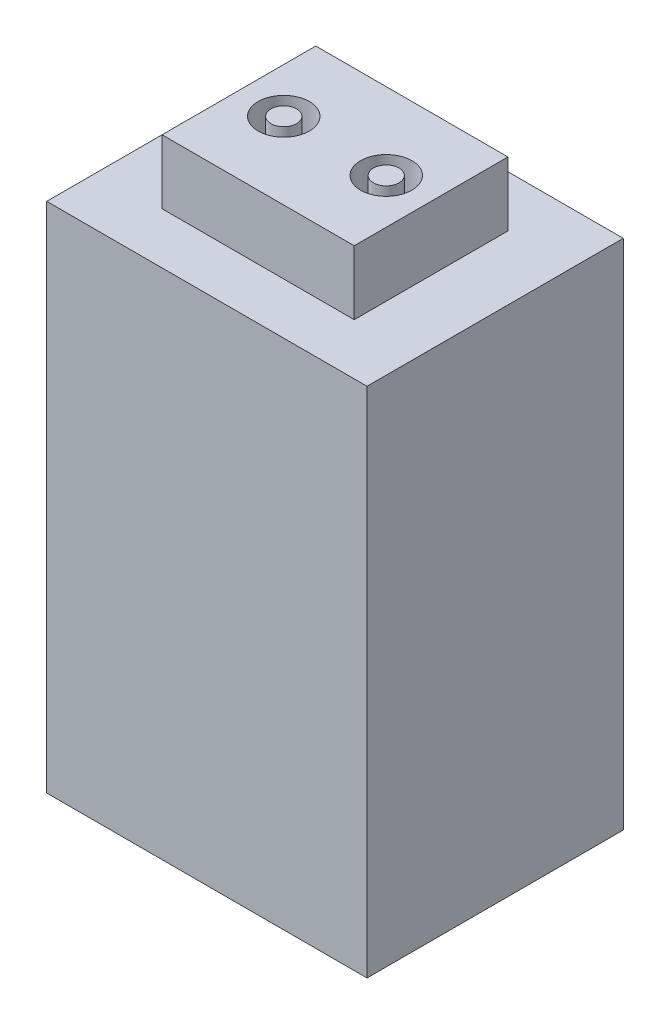
ISO-10303-21;
HEADER;
FILE_DESCRIPTION(('STEP AP214'),'2;1');
FILE_NAME('part.step','',(''),(''),'','','');
FILE_SCHEMA(('AUTOMOTIVE_DESIGN { 1 0 10303 214 1 1 1 1 }'));
ENDSEC;
DATA;
#1=APPLICATION_CONTEXT('core data for automotive mechanical design processes');
#2=APPLICATION_PROTOCOL_DEFINITION('international standard','automotive_design',2000,#1);
#3=PRODUCT_CONTEXT('',#1,'mechanical');
#4=PRODUCT('Part','Part','',(#3));
#5=PRODUCT_RELATED_PRODUCT_CATEGORY('part','',(#4));
#6=PRODUCT_DEFINITION_FORMATION('','',#4);
#7=PRODUCT_DEFINITION_CONTEXT('part definition',#1,'design');
#8=PRODUCT_DEFINITION('design','',#6,#7);
#9=PRODUCT_DEFINITION_SHAPE('','',#8);
#10=(LENGTH_UNIT() NAMED_UNIT(*) SI_UNIT(.MILLI.,.METRE.));
#11=(NAMED_UNIT(*) PLANE_ANGLE_UNIT() SI_UNIT($,.RADIAN.));
#12=(NAMED_UNIT(*) SI_UNIT($,.STERADIAN.) SOLID_ANGLE_UNIT());
#13=UNCERTAINTY_MEASURE_WITH_UNIT(LENGTH_MEASURE(1.E-05),#10,'distance_accuracy_value','');
#14=(GEOMETRIC_REPRESENTATION_CONTEXT(3) GLOBAL_UNCERTAINTY_ASSIGNED_CONTEXT((#13)) GLOBAL_UNIT_ASSIGNED_CONTEXT((#10,
#11,#12)) REPRESENTATION_CONTEXT('',''));
#15=CARTESIAN_POINT('',(0.,0.,0.));
#16=DIRECTION('',(0.,0.,1.));
#17=DIRECTION('',(1.,0.,0.));
#18=AXIS2_PLACEMENT_3D('',#15,#16,#17);
#19=CARTESIAN_POINT('',(0.,80.,40.));
#20=DIRECTION('',(0.,-1.,0.));
#21=DIRECTION('',(0.,0.,-1.));
#22=AXIS2_PLACEMENT_3D('',#19,#20,#21);
#23=PLANE('',#22);
#24=DIRECTION('',(-1.,0.,0.));
#25=VECTOR('',#24,1.);
#26=CARTESIAN_POINT('',(0.,80.,0.));
#27=LINE('',#26,#25);
#28=CARTESIAN_POINT('',(0.,80.,0.));
#29=VERTEX_POINT('',#28);
#30=CARTESIAN_POINT('',(-50.,80.,0.));
#31=VERTEX_POINT('',#30);
#32=EDGE_CURVE('E151',#29,#31,#27,.T.);
#33=ORIENTED_EDGE('',*,*,#32,.T.);
#34=DIRECTION('',(0.,0.,-1.));
#35=VECTOR('',#34,1.);
#36=CARTESIAN_POINT('',(-50.,80.,40.));
#37=LINE('',#36,#35);
#38=CARTESIAN_POINT('',(-50.,80.,40.));
#39=VERTEX_POINT('',#38);
#40=EDGE_CURVE('E156',#39,#31,#37,.T.);
#41=ORIENTED_EDGE('',*,*,#40,.F.);
#42=DIRECTION('',(-1.,0.,0.));
#43=VECTOR('',#42,1.);
#44=CARTESIAN_POINT('',(0.,80.,40.));
#45=LINE('',#44,#43);
#46=CARTESIAN_POINT('',(0.,80.,40.));
#47=VERTEX_POINT('',#46);
#48=EDGE_CURVE('E144',#47,#39,#45,.T.);
#49=ORIENTED_EDGE('',*,*,#48,.F.);
#50=DIRECTION('',(0.,0.,-1.));
#51=VECTOR('',#50,1.);
#52=CARTESIAN_POINT('',(0.,80.,40.));
#53=LINE('',#52,#51);
#54=EDGE_CURVE('E52',#47,#29,#53,.T.);
#55=ORIENTED_EDGE('',*,*,#54,.T.);
#56=EDGE_LOOP('',(#33,#41,#49,#55));
#57=FACE_BOUND('',#56,.T.);
#58=DIRECTION('',(0.,0.,-1.));
#59=VECTOR('',#58,1.);
#60=CARTESIAN_POINT('',(-10.,80.,8.));
#61=LINE('',#60,#59);
#62=CARTESIAN_POINT('',(-10.,80.,32.));
#63=VERTEX_POINT('',#62);
#64=CARTESIAN_POINT('',(-10.,80.,8.));
#65=VERTEX_POINT('',#64);
#66=EDGE_CURVE('E58',#63,#65,#61,.T.);
#67=ORIENTED_EDGE('',*,*,#66,.F.);
#68=DIRECTION('',(1.,0.,0.));
#69=VECTOR('',#68,1.);
#70=CARTESIAN_POINT('',(-40.,80.,32.));
#71=LINE('',#70,#69);
#72=CARTESIAN_POINT('',(-40.,80.,32.));
#73=VERTEX_POINT('',#72);
#74=EDGE_CURVE('E61',#73,#63,#71,.T.);
#75=ORIENTED_EDGE('',*,*,#74,.F.);
#76=DIRECTION('',(0.,0.,1.));
#77=VECTOR('',#76,1.);
#78=CARTESIAN_POINT('',(-40.,80.,8.));
#79=LINE('',#78,#77);
#80=CARTESIAN_POINT('',(-40.,80.,8.));
#81=VERTEX_POINT('',#80);
#82=EDGE_CURVE('E273',#81,#73,#79,.T.);
#83=ORIENTED_EDGE('',*,*,#82,.F.);
#84=DIRECTION('',(-1.,0.,0.));
#85=VECTOR('',#84,1.);
#86=CARTESIAN_POINT('',(-40.,80.,8.));
#87=LINE('',#86,#85);
#88=EDGE_CURVE('E275',#65,#81,#87,.T.);
#89=ORIENTED_EDGE('',*,*,#88,.F.);
#90=EDGE_LOOP('',(#67,#75,#83,#89));
#91=FACE_BOUND('',#90,.T.);
#92=ADVANCED_FACE('F44',(#57,#91),#23,.F.);
#93=CARTESIAN_POINT('',(0.,0.,40.));
#94=DIRECTION('',(0.,1.,0.));
#95=DIRECTION('',(0.,0.,1.));
#96=AXIS2_PLACEMENT_3D('',#93,#94,#95);
#97=PLANE('',#96);
#98=DIRECTION('',(1.,0.,0.));
#99=VECTOR('',#98,1.);
#100=CARTESIAN_POINT('',(0.,0.,0.));
#101=LINE('',#100,#99);
#102=CARTESIAN_POINT('',(-50.,0.,0.));
#103=VERTEX_POINT('',#102);
#104=CARTESIAN_POINT('',(0.,0.,0.));
#105=VERTEX_POINT('',#104);
#106=EDGE_CURVE('E128',#103,#105,#101,.T.);
#107=ORIENTED_EDGE('',*,*,#106,.T.);
#108=DIRECTION('',(0.,0.,-1.));
#109=VECTOR('',#108,1.);
#110=CARTESIAN_POINT('',(0.,0.,40.));
#111=LINE('',#110,#109);
#112=CARTESIAN_POINT('',(0.,0.,40.));
#113=VERTEX_POINT('',#112);
#114=EDGE_CURVE('E11',#113,#105,#111,.T.);
#115=ORIENTED_EDGE('',*,*,#114,.F.);
#116=DIRECTION('',(1.,0.,0.));
#117=VECTOR('',#116,1.);
#118=CARTESIAN_POINT('',(0.,0.,40.));
#119=LINE('',#118,#117);
#120=CARTESIAN_POINT('',(-50.,0.,40.));
#121=VERTEX_POINT('',#120);
#122=EDGE_CURVE('E138',#121,#113,#119,.T.);
#123=ORIENTED_EDGE('',*,*,#122,.F.);
#124=DIRECTION('',(0.,0.,-1.));
#125=VECTOR('',#124,1.);
#126=CARTESIAN_POINT('',(-50.,0.,40.));
#127=LINE('',#126,#125);
#128=EDGE_CURVE('E146',#121,#103,#127,.T.);
#129=ORIENTED_EDGE('',*,*,#128,.T.);
#130=EDGE_LOOP('',(#107,#115,#123,#129));
#131=FACE_BOUND('',#130,.T.);
#132=ADVANCED_FACE('F50',(#131),#97,.F.);
#133=CARTESIAN_POINT('',(0.,0.,40.));
#134=DIRECTION('',(-1.,0.,0.));
#135=DIRECTION('',(0.,0.,1.));
#136=AXIS2_PLACEMENT_3D('',#133,#134,#135);
#137=PLANE('',#136);
#138=DIRECTION('',(0.,1.,0.));
#139=VECTOR('',#138,1.);
#140=CARTESIAN_POINT('',(0.,0.,0.));
#141=LINE('',#140,#139);
#142=EDGE_CURVE('E134',#105,#29,#141,.T.);
#143=ORIENTED_EDGE('',*,*,#142,.T.);
#144=ORIENTED_EDGE('',*,*,#54,.F.);
#145=DIRECTION('',(0.,1.,0.));
#146=VECTOR('',#145,1.);
#147=CARTESIAN_POINT('',(0.,0.,40.));
#148=LINE('',#147,#146);
#149=EDGE_CURVE('E142',#113,#47,#148,.T.);
#150=ORIENTED_EDGE('',*,*,#149,.F.);
#151=ORIENTED_EDGE('',*,*,#114,.T.);
#152=EDGE_LOOP('',(#143,#144,#150,#151));
#153=FACE_BOUND('',#152,.T.);
#154=ADVANCED_FACE('F180',(#153),#137,.F.);
#155=CARTESIAN_POINT('',(-50.,0.,40.));
#156=DIRECTION('',(1.,0.,0.));
#157=DIRECTION('',(0.,0.,-1.));
#158=AXIS2_PLACEMENT_3D('',#155,#156,#157);
#159=PLANE('',#158);
#160=DIRECTION('',(0.,-1.,0.));
#161=VECTOR('',#160,1.);
#162=CARTESIAN_POINT('',(-50.,0.,0.));
#163=LINE('',#162,#161);
#164=EDGE_CURVE('E141',#31,#103,#163,.T.);
#165=ORIENTED_EDGE('',*,*,#164,.T.);
#166=ORIENTED_EDGE('',*,*,#128,.F.);
#167=DIRECTION('',(0.,-1.,0.));
#168=VECTOR('',#167,1.);
#169=CARTESIAN_POINT('',(-50.,0.,40.));
#170=LINE('',#169,#168);
#171=EDGE_CURVE('E150',#39,#121,#170,.T.);
#172=ORIENTED_EDGE('',*,*,#171,.F.);
#173=ORIENTED_EDGE('',*,*,#40,.T.);
#174=EDGE_LOOP('',(#165,#166,#172,#173));
#175=FACE_BOUND('',#174,.T.);
#176=ADVANCED_FACE('F172',(#175),#159,.F.);
#177=CARTESIAN_POINT('',(0.,0.,40.));
#178=DIRECTION('',(0.,0.,-1.));
#179=DIRECTION('',(-1.,0.,0.));
#180=AXIS2_PLACEMENT_3D('',#177,#178,#179);
#181=PLANE('',#180);
#182=ORIENTED_EDGE('',*,*,#122,.T.);
#183=ORIENTED_EDGE('',*,*,#149,.T.);
#184=ORIENTED_EDGE('',*,*,#48,.T.);
#185=ORIENTED_EDGE('',*,*,#171,.T.);
#186=EDGE_LOOP('',(#182,#183,#184,#185));
#187=FACE_BOUND('',#186,.T.);
#188=ADVANCED_FACE('F176',(#187),#181,.F.);
#189=CARTESIAN_POINT('',(0.,0.,0.));
#190=DIRECTION('',(0.,0.,-1.));
#191=DIRECTION('',(-1.,0.,0.));
#192=AXIS2_PLACEMENT_3D('',#189,#190,#191);
#193=PLANE('',#192);
#194=ORIENTED_EDGE('',*,*,#106,.F.);
#195=ORIENTED_EDGE('',*,*,#164,.F.);
#196=ORIENTED_EDGE('',*,*,#32,.F.);
#197=ORIENTED_EDGE('',*,*,#142,.F.);
#198=EDGE_LOOP('',(#194,#195,#196,#197));
#199=FACE_BOUND('',#198,.T.);
#200=ADVANCED_FACE('F169',(#199),#193,.T.);
#201=CARTESIAN_POINT('',(-10.,90.,8.));
#202=DIRECTION('',(-1.,0.,0.));
#203=DIRECTION('',(0.,0.,1.));
#204=AXIS2_PLACEMENT_3D('',#201,#202,#203);
#205=PLANE('',#204);
#206=ORIENTED_EDGE('',*,*,#66,.T.);
#207=DIRECTION('',(0.,-1.,0.));
#208=VECTOR('',#207,1.);
#209=CARTESIAN_POINT('',(-10.,90.,8.));
#210=LINE('',#209,#208);
#211=CARTESIAN_POINT('',(-10.,90.,8.));
#212=VERTEX_POINT('',#211);
#213=EDGE_CURVE('E114',#212,#65,#210,.T.);
#214=ORIENTED_EDGE('',*,*,#213,.F.);
#215=DIRECTION('',(0.,0.,-1.));
#216=VECTOR('',#215,1.);
#217=CARTESIAN_POINT('',(-10.,90.,8.));
#218=LINE('',#217,#216);
#219=CARTESIAN_POINT('',(-10.,90.,32.));
#220=VERTEX_POINT('',#219);
#221=EDGE_CURVE('E116',#220,#212,#218,.T.);
#222=ORIENTED_EDGE('',*,*,#221,.F.);
#223=DIRECTION('',(0.,-1.,0.));
#224=VECTOR('',#223,1.);
#225=CARTESIAN_POINT('',(-10.,90.,32.));
#226=LINE('',#225,#224);
#227=EDGE_CURVE('E269',#220,#63,#226,.T.);
#228=ORIENTED_EDGE('',*,*,#227,.T.);
#229=EDGE_LOOP('',(#206,#214,#222,#228));
#230=FACE_BOUND('',#229,.T.);
#231=ADVANCED_FACE('F129',(#230),#205,.F.);
#232=CARTESIAN_POINT('',(-40.,90.,8.));
#233=DIRECTION('',(0.,0.,1.));
#234=DIRECTION('',(1.,0.,0.));
#235=AXIS2_PLACEMENT_3D('',#232,#233,#234);
#236=PLANE('',#235);
#237=ORIENTED_EDGE('',*,*,#88,.T.);
#238=DIRECTION('',(0.,-1.,0.));
#239=VECTOR('',#238,1.);
#240=CARTESIAN_POINT('',(-40.,90.,8.));
#241=LINE('',#240,#239);
#242=CARTESIAN_POINT('',(-40.,90.,8.));
#243=VERTEX_POINT('',#242);
#244=EDGE_CURVE('E113',#243,#81,#241,.T.);
#245=ORIENTED_EDGE('',*,*,#244,.F.);
#246=DIRECTION('',(-1.,0.,0.));
#247=VECTOR('',#246,1.);
#248=CARTESIAN_POINT('',(-40.,90.,8.));
#249=LINE('',#248,#247);
#250=EDGE_CURVE('E107',#212,#243,#249,.T.);
#251=ORIENTED_EDGE('',*,*,#250,.F.);
#252=ORIENTED_EDGE('',*,*,#213,.T.);
#253=EDGE_LOOP('',(#237,#245,#251,#252));
#254=FACE_BOUND('',#253,.T.);
#255=ADVANCED_FACE('F112',(#254),#236,.F.);
#256=CARTESIAN_POINT('',(-40.,90.,8.));
#257=DIRECTION('',(1.,0.,0.));
#258=DIRECTION('',(0.,0.,-1.));
#259=AXIS2_PLACEMENT_3D('',#256,#257,#258);
#260=PLANE('',#259);
#261=ORIENTED_EDGE('',*,*,#82,.T.);
#262=DIRECTION('',(0.,-1.,0.));
#263=VECTOR('',#262,1.);
#264=CARTESIAN_POINT('',(-40.,90.,32.));
#265=LINE('',#264,#263);
#266=CARTESIAN_POINT('',(-40.,90.,32.));
#267=VERTEX_POINT('',#266);
#268=EDGE_CURVE('E133',#267,#73,#265,.T.);
#269=ORIENTED_EDGE('',*,*,#268,.F.);
#270=DIRECTION('',(0.,0.,1.));
#271=VECTOR('',#270,1.);
#272=CARTESIAN_POINT('',(-40.,90.,8.));
#273=LINE('',#272,#271);
#274=EDGE_CURVE('E119',#243,#267,#273,.T.);
#275=ORIENTED_EDGE('',*,*,#274,.F.);
#276=ORIENTED_EDGE('',*,*,#244,.T.);
#277=EDGE_LOOP('',(#261,#269,#275,#276));
#278=FACE_BOUND('',#277,.T.);
#279=ADVANCED_FACE('F200',(#278),#260,.F.);
#280=CARTESIAN_POINT('',(-40.,90.,32.));
#281=DIRECTION('',(0.,0.,-1.));
#282=DIRECTION('',(-1.,0.,0.));
#283=AXIS2_PLACEMENT_3D('',#280,#281,#282);
#284=PLANE('',#283);
#285=ORIENTED_EDGE('',*,*,#74,.T.);
#286=ORIENTED_EDGE('',*,*,#227,.F.);
#287=DIRECTION('',(1.,0.,0.));
#288=VECTOR('',#287,1.);
#289=CARTESIAN_POINT('',(-40.,90.,32.));
#290=LINE('',#289,#288);
#291=EDGE_CURVE('E123',#267,#220,#290,.T.);
#292=ORIENTED_EDGE('',*,*,#291,.F.);
#293=ORIENTED_EDGE('',*,*,#268,.T.);
#294=EDGE_LOOP('',(#285,#286,#292,#293));
#295=FACE_BOUND('',#294,.T.);
#296=ADVANCED_FACE('F205',(#295),#284,.F.);
#297=CARTESIAN_POINT('',(0.,90.,0.));
#298=DIRECTION('',(0.,1.,0.));
#299=DIRECTION('',(0.,0.,1.));
#300=AXIS2_PLACEMENT_3D('',#297,#298,#299);
#301=PLANE('',#300);
#302=CARTESIAN_POINT('',(-17.,90.,20.));
#303=DIRECTION('',(0.,1.,0.));
#304=DIRECTION('',(0.,0.,1.));
#305=AXIS2_PLACEMENT_3D('',#302,#303,#304);
#306=CIRCLE('',#305,4.);
#307=CARTESIAN_POINT('',(-17.,90.,24.));
#308=VERTEX_POINT('',#307);
#309=EDGE_CURVE('E248',#308,#308,#306,.T.);
#310=ORIENTED_EDGE('',*,*,#309,.F.);
#311=EDGE_LOOP('',(#310));
#312=FACE_BOUND('',#311,.T.);
#313=CARTESIAN_POINT('',(-33.,90.,20.));
#314=DIRECTION('',(0.,1.,0.));
#315=DIRECTION('',(0.,0.,1.));
#316=AXIS2_PLACEMENT_3D('',#313,#314,#315);
#317=CIRCLE('',#316,4.);
#318=CARTESIAN_POINT('',(-33.,90.,24.));
#319=VERTEX_POINT('',#318);
#320=EDGE_CURVE('E257',#319,#319,#317,.T.);
#321=ORIENTED_EDGE('',*,*,#320,.F.);
#322=EDGE_LOOP('',(#321));
#323=FACE_BOUND('',#322,.T.);
#324=ORIENTED_EDGE('',*,*,#221,.T.);
#325=ORIENTED_EDGE('',*,*,#250,.T.);
#326=ORIENTED_EDGE('',*,*,#274,.T.);
#327=ORIENTED_EDGE('',*,*,#291,.T.);
#328=EDGE_LOOP('',(#324,#325,#326,#327));
#329=FACE_BOUND('',#328,.T.);
#330=ADVANCED_FACE('F121',(#312,#323,#329),#301,.T.);
#331=CARTESIAN_POINT('',(-33.,85.,20.));
#332=DIRECTION('',(0.,1.,0.));
#333=DIRECTION('',(0.,0.,1.));
#334=AXIS2_PLACEMENT_3D('',#331,#332,#333);
#335=CYLINDRICAL_SURFACE('',#334,4.);
#336=CARTESIAN_POINT('',(-33.,85.,20.));
#337=DIRECTION('',(0.,1.,0.));
#338=DIRECTION('',(0.,0.,1.));
#339=AXIS2_PLACEMENT_3D('',#336,#337,#338);
#340=CIRCLE('',#339,4.);
#341=CARTESIAN_POINT('',(-33.,85.,24.));
#342=VERTEX_POINT('',#341);
#343=EDGE_CURVE('E263',#342,#342,#340,.T.);
#344=ORIENTED_EDGE('',*,*,#343,.F.);
#345=EDGE_LOOP('',(#344));
#346=FACE_BOUND('',#345,.T.);
#347=ORIENTED_EDGE('',*,*,#320,.T.);
#348=EDGE_LOOP('',(#347));
#349=FACE_BOUND('',#348,.T.);
#350=ADVANCED_FACE('F207',(#346,#349),#335,.F.);
#351=CARTESIAN_POINT('',(-33.,85.,20.));
#352=DIRECTION('',(0.,1.,0.));
#353=DIRECTION('',(0.,0.,1.));
#354=AXIS2_PLACEMENT_3D('',#351,#352,#353);
#355=PLANE('',#354);
#356=CARTESIAN_POINT('',(-33.,85.,20.));
#357=DIRECTION('',(0.,1.,0.));
#358=DIRECTION('',(0.,0.,1.));
#359=AXIS2_PLACEMENT_3D('',#356,#357,#358);
#360=CIRCLE('',#359,2.);
#361=CARTESIAN_POINT('',(-33.,85.,22.));
#362=VERTEX_POINT('',#361);
#363=EDGE_CURVE('E252',#362,#362,#360,.T.);
#364=ORIENTED_EDGE('',*,*,#363,.F.);
#365=EDGE_LOOP('',(#364));
#366=FACE_BOUND('',#365,.T.);
#367=ORIENTED_EDGE('',*,*,#343,.T.);
#368=EDGE_LOOP('',(#367));
#369=FACE_BOUND('',#368,.T.);
#370=ADVANCED_FACE('F220',(#366,#369),#355,.T.);
#371=CARTESIAN_POINT('',(-33.,85.,20.));
#372=DIRECTION('',(0.,1.,0.));
#373=DIRECTION('',(0.,0.,1.));
#374=AXIS2_PLACEMENT_3D('',#371,#372,#373);
#375=CYLINDRICAL_SURFACE('',#374,2.);
#376=ORIENTED_EDGE('',*,*,#363,.T.);
#377=EDGE_LOOP('',(#376));
#378=FACE_BOUND('',#377,.T.);
#379=CARTESIAN_POINT('',(-33.,90.,20.));
#380=DIRECTION('',(0.,1.,0.));
#381=DIRECTION('',(0.,0.,1.));
#382=AXIS2_PLACEMENT_3D('',#379,#380,#381);
#383=CIRCLE('',#382,2.);
#384=CARTESIAN_POINT('',(-33.,90.,22.));
#385=VERTEX_POINT('',#384);
#386=EDGE_CURVE('E246',#385,#385,#383,.T.);
#387=ORIENTED_EDGE('',*,*,#386,.F.);
#388=EDGE_LOOP('',(#387));
#389=FACE_BOUND('',#388,.T.);
#390=ADVANCED_FACE('F213',(#378,#389),#375,.T.);
#391=CARTESIAN_POINT('',(-17.,85.,20.));
#392=DIRECTION('',(0.,1.,0.));
#393=DIRECTION('',(0.,0.,1.));
#394=AXIS2_PLACEMENT_3D('',#391,#392,#393);
#395=CYLINDRICAL_SURFACE('',#394,4.);
#396=CARTESIAN_POINT('',(-17.,85.,20.));
#397=DIRECTION('',(0.,1.,0.));
#398=DIRECTION('',(0.,0.,1.));
#399=AXIS2_PLACEMENT_3D('',#396,#397,#398);
#400=CIRCLE('',#399,4.);
#401=CARTESIAN_POINT('',(-17.,85.,24.));
#402=VERTEX_POINT('',#401);
#403=EDGE_CURVE('E254',#402,#402,#400,.T.);
#404=ORIENTED_EDGE('',*,*,#403,.F.);
#405=EDGE_LOOP('',(#404));
#406=FACE_BOUND('',#405,.T.);
#407=ORIENTED_EDGE('',*,*,#309,.T.);
#408=EDGE_LOOP('',(#407));
#409=FACE_BOUND('',#408,.T.);
#410=ADVANCED_FACE('F216',(#406,#409),#395,.F.);
#411=CARTESIAN_POINT('',(-17.,85.,20.));
#412=DIRECTION('',(0.,1.,0.));
#413=DIRECTION('',(0.,0.,1.));
#414=AXIS2_PLACEMENT_3D('',#411,#412,#413);
#415=PLANE('',#414);
#416=CARTESIAN_POINT('',(-17.,85.,20.));
#417=DIRECTION('',(0.,1.,0.));
#418=DIRECTION('',(0.,0.,1.));
#419=AXIS2_PLACEMENT_3D('',#416,#417,#418);
#420=CIRCLE('',#419,2.);
#421=CARTESIAN_POINT('',(-17.,85.,22.));
#422=VERTEX_POINT('',#421);
#423=EDGE_CURVE('E245',#422,#422,#420,.T.);
#424=ORIENTED_EDGE('',*,*,#423,.F.);
#425=EDGE_LOOP('',(#424));
#426=FACE_BOUND('',#425,.T.);
#427=ORIENTED_EDGE('',*,*,#403,.T.);
#428=EDGE_LOOP('',(#427));
#429=FACE_BOUND('',#428,.T.);
#430=ADVANCED_FACE('F230',(#426,#429),#415,.T.);
#431=CARTESIAN_POINT('',(-17.,85.,20.));
#432=DIRECTION('',(0.,1.,0.));
#433=DIRECTION('',(0.,0.,1.));
#434=AXIS2_PLACEMENT_3D('',#431,#432,#433);
#435=CYLINDRICAL_SURFACE('',#434,2.);
#436=ORIENTED_EDGE('',*,*,#423,.T.);
#437=EDGE_LOOP('',(#436));
#438=FACE_BOUND('',#437,.T.);
#439=CARTESIAN_POINT('',(-17.,90.,20.));
#440=DIRECTION('',(0.,1.,0.));
#441=DIRECTION('',(0.,0.,1.));
#442=AXIS2_PLACEMENT_3D('',#439,#440,#441);
#443=CIRCLE('',#442,2.);
#444=CARTESIAN_POINT('',(-17.,90.,22.));
#445=VERTEX_POINT('',#444);
#446=EDGE_CURVE('E243',#445,#445,#443,.T.);
#447=ORIENTED_EDGE('',*,*,#446,.F.);
#448=EDGE_LOOP('',(#447));
#449=FACE_BOUND('',#448,.T.);
#450=ADVANCED_FACE('F234',(#438,#449),#435,.T.);
#451=ORIENTED_EDGE('',*,*,#386,.T.);
#452=EDGE_LOOP('',(#451));
#453=FACE_BOUND('',#452,.T.);
#454=ADVANCED_FACE('F215',(#453),#301,.T.);
#455=ORIENTED_EDGE('',*,*,#446,.T.);
#456=EDGE_LOOP('',(#455));
#457=FACE_BOUND('',#456,.T.);
#458=ADVANCED_FACE('F211',(#457),#301,.T.);
#459=CLOSED_SHELL('',(#92,#132,#154,#176,#188,#200,#231,#255,#279,#296,#330,#350,#370,#390,#410,
#430,#450,#454,#458));
#460=MANIFOLD_SOLID_BREP('B2',#459);
#461=ADVANCED_BREP_SHAPE_REPRESENTATION('',(#18,#460),#14);
#462=SHAPE_DEFINITION_REPRESENTATION(#9,#461);
ENDSEC;
END-ISO-10303-21;
